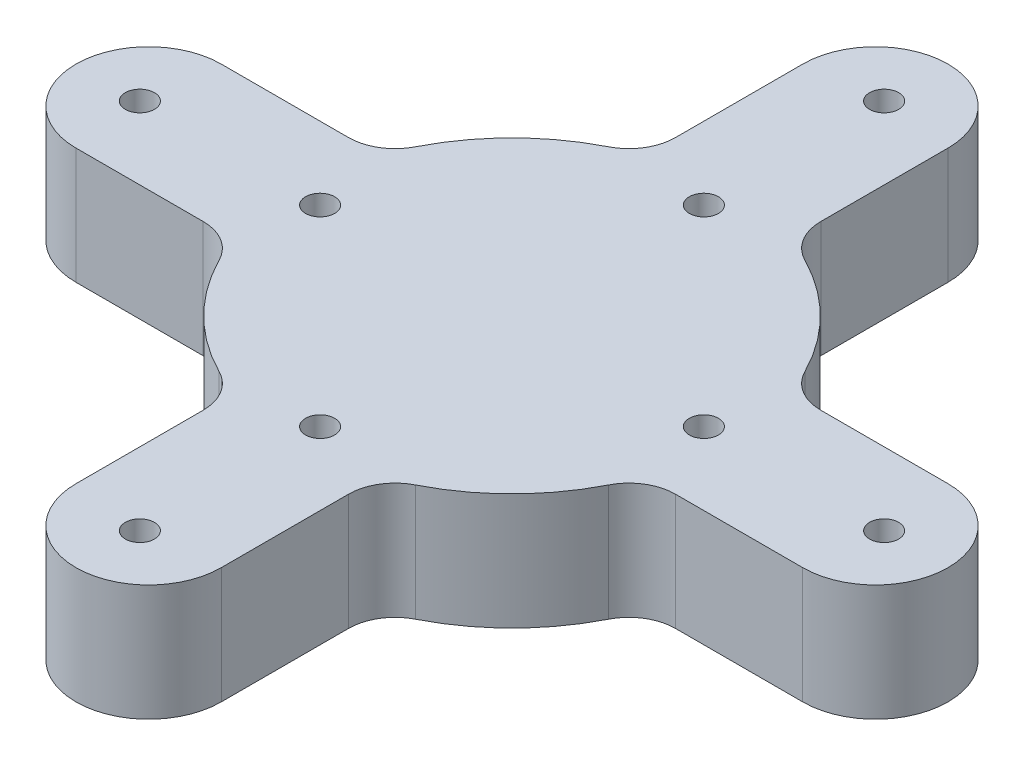
ISO-10303-21;
HEADER;
FILE_DESCRIPTION(('STEP AP214'),'2;1');
FILE_NAME('part.step','',(''),(''),'','','');
FILE_SCHEMA(('AUTOMOTIVE_DESIGN { 1 0 10303 214 1 1 1 1 }'));
ENDSEC;
DATA;
#1=APPLICATION_CONTEXT('core data for automotive mechanical design processes');
#2=APPLICATION_PROTOCOL_DEFINITION('international standard','automotive_design',2000,#1);
#3=PRODUCT_CONTEXT('',#1,'mechanical');
#4=PRODUCT('Part','Part','',(#3));
#5=PRODUCT_RELATED_PRODUCT_CATEGORY('part','',(#4));
#6=PRODUCT_DEFINITION_FORMATION('','',#4);
#7=PRODUCT_DEFINITION_CONTEXT('part definition',#1,'design');
#8=PRODUCT_DEFINITION('design','',#6,#7);
#9=PRODUCT_DEFINITION_SHAPE('','',#8);
#10=(LENGTH_UNIT() NAMED_UNIT(*) SI_UNIT(.MILLI.,.METRE.));
#11=(NAMED_UNIT(*) PLANE_ANGLE_UNIT() SI_UNIT($,.RADIAN.));
#12=(NAMED_UNIT(*) SI_UNIT($,.STERADIAN.) SOLID_ANGLE_UNIT());
#13=UNCERTAINTY_MEASURE_WITH_UNIT(LENGTH_MEASURE(1.E-05),#10,'distance_accuracy_value','');
#14=(GEOMETRIC_REPRESENTATION_CONTEXT(3) GLOBAL_UNCERTAINTY_ASSIGNED_CONTEXT((#13)) GLOBAL_UNIT_ASSIGNED_CONTEXT((#10,
#11,#12)) REPRESENTATION_CONTEXT('',''));
#15=CARTESIAN_POINT('',(0.,0.,0.));
#16=DIRECTION('',(0.,0.,1.));
#17=DIRECTION('',(1.,0.,0.));
#18=AXIS2_PLACEMENT_3D('',#15,#16,#17);
#19=CARTESIAN_POINT('',(0.,20.,-62.4999999999996));
#20=DIRECTION('',(0.,-1.,0.));
#21=DIRECTION('',(0.,0.,-1.));
#22=AXIS2_PLACEMENT_3D('',#19,#20,#21);
#23=CYLINDRICAL_SURFACE('',#22,12.5);
#24=DIRECTION('',(0.,-1.,0.));
#25=VECTOR('',#24,1.);
#26=CARTESIAN_POINT('',(-12.5,20.,-62.4999999999996));
#27=LINE('',#26,#25);
#28=CARTESIAN_POINT('',(-12.5,20.,-62.4999999999996));
#29=VERTEX_POINT('',#28);
#30=CARTESIAN_POINT('',(-12.5,0.,-62.4999999999996));
#31=VERTEX_POINT('',#30);
#32=EDGE_CURVE('E322',#29,#31,#27,.T.);
#33=ORIENTED_EDGE('',*,*,#32,.F.);
#34=CARTESIAN_POINT('',(0.,20.,-62.4999999999996));
#35=DIRECTION('',(0.,1.,0.));
#36=DIRECTION('',(0.,0.,1.));
#37=AXIS2_PLACEMENT_3D('',#34,#35,#36);
#38=CIRCLE('',#37,12.5);
#39=CARTESIAN_POINT('',(12.5,20.,-62.4999999999996));
#40=VERTEX_POINT('',#39);
#41=EDGE_CURVE('E330',#40,#29,#38,.T.);
#42=ORIENTED_EDGE('',*,*,#41,.F.);
#43=DIRECTION('',(0.,1.,0.));
#44=VECTOR('',#43,1.);
#45=CARTESIAN_POINT('',(12.5,20.,-62.4999999999996));
#46=LINE('',#45,#44);
#47=CARTESIAN_POINT('',(12.5,0.,-62.4999999999996));
#48=VERTEX_POINT('',#47);
#49=EDGE_CURVE('E326',#48,#40,#46,.T.);
#50=ORIENTED_EDGE('',*,*,#49,.F.);
#51=CARTESIAN_POINT('',(0.,0.,-62.4999999999996));
#52=DIRECTION('',(0.,1.,0.));
#53=DIRECTION('',(0.,0.,1.));
#54=AXIS2_PLACEMENT_3D('',#51,#52,#53);
#55=CIRCLE('',#54,12.5);
#56=EDGE_CURVE('E334',#31,#48,#55,.F.);
#57=ORIENTED_EDGE('',*,*,#56,.F.);
#58=EDGE_LOOP('',(#33,#42,#50,#57));
#59=FACE_BOUND('',#58,.T.);
#60=ADVANCED_FACE('F84',(#59),#23,.T.);
#61=CARTESIAN_POINT('',(-62.5,0.,0.));
#62=DIRECTION('',(0.,-1.,0.));
#63=DIRECTION('',(0.,0.,-1.));
#64=AXIS2_PLACEMENT_3D('',#61,#62,#63);
#65=CYLINDRICAL_SURFACE('',#64,12.5);
#66=DIRECTION('',(0.,-1.,0.));
#67=VECTOR('',#66,1.);
#68=CARTESIAN_POINT('',(-62.5,20.,-12.5));
#69=LINE('',#68,#67);
#70=CARTESIAN_POINT('',(-62.5,0.,-12.5));
#71=VERTEX_POINT('',#70);
#72=CARTESIAN_POINT('',(-62.5,20.,-12.5));
#73=VERTEX_POINT('',#72);
#74=EDGE_CURVE('E308',#71,#73,#69,.F.);
#75=ORIENTED_EDGE('',*,*,#74,.F.);
#76=CARTESIAN_POINT('',(-62.5,0.,0.));
#77=DIRECTION('',(0.,1.,0.));
#78=DIRECTION('',(0.,0.,1.));
#79=AXIS2_PLACEMENT_3D('',#76,#77,#78);
#80=CIRCLE('',#79,12.5);
#81=CARTESIAN_POINT('',(-62.5,0.,12.5));
#82=VERTEX_POINT('',#81);
#83=EDGE_CURVE('E316',#82,#71,#80,.F.);
#84=ORIENTED_EDGE('',*,*,#83,.F.);
#85=DIRECTION('',(0.,1.,0.));
#86=VECTOR('',#85,1.);
#87=CARTESIAN_POINT('',(-62.5,0.,12.5));
#88=LINE('',#87,#86);
#89=CARTESIAN_POINT('',(-62.5,20.,12.5));
#90=VERTEX_POINT('',#89);
#91=EDGE_CURVE('E312',#90,#82,#88,.F.);
#92=ORIENTED_EDGE('',*,*,#91,.F.);
#93=CARTESIAN_POINT('',(-62.5,20.,0.));
#94=DIRECTION('',(0.,1.,0.));
#95=DIRECTION('',(0.,0.,1.));
#96=AXIS2_PLACEMENT_3D('',#93,#94,#95);
#97=CIRCLE('',#96,12.5);
#98=EDGE_CURVE('E319',#73,#90,#97,.T.);
#99=ORIENTED_EDGE('',*,*,#98,.F.);
#100=EDGE_LOOP('',(#75,#84,#92,#99));
#101=FACE_BOUND('',#100,.T.);
#102=ADVANCED_FACE('F617',(#101),#65,.T.);
#103=CARTESIAN_POINT('',(0.,0.,62.5000000000005));
#104=DIRECTION('',(0.,-1.,0.));
#105=DIRECTION('',(0.,0.,-1.));
#106=AXIS2_PLACEMENT_3D('',#103,#104,#105);
#107=CYLINDRICAL_SURFACE('',#106,12.5);
#108=DIRECTION('',(0.,1.,0.));
#109=VECTOR('',#108,1.);
#110=CARTESIAN_POINT('',(-12.5,0.,62.5000000000005));
#111=LINE('',#110,#109);
#112=CARTESIAN_POINT('',(-12.5,0.,62.5000000000005));
#113=VERTEX_POINT('',#112);
#114=CARTESIAN_POINT('',(-12.5,20.,62.5000000000005));
#115=VERTEX_POINT('',#114);
#116=EDGE_CURVE('E272',#113,#115,#111,.T.);
#117=ORIENTED_EDGE('',*,*,#116,.F.);
#118=CARTESIAN_POINT('',(0.,0.,62.5000000000005));
#119=DIRECTION('',(0.,1.,0.));
#120=DIRECTION('',(0.,0.,1.));
#121=AXIS2_PLACEMENT_3D('',#118,#119,#120);
#122=CIRCLE('',#121,12.5);
#123=CARTESIAN_POINT('',(12.5,0.,62.5000000000005));
#124=VERTEX_POINT('',#123);
#125=EDGE_CURVE('E302',#124,#113,#122,.F.);
#126=ORIENTED_EDGE('',*,*,#125,.F.);
#127=DIRECTION('',(0.,-1.,0.));
#128=VECTOR('',#127,1.);
#129=CARTESIAN_POINT('',(12.5,20.,62.5000000000005));
#130=LINE('',#129,#128);
#131=CARTESIAN_POINT('',(12.5,20.,62.5000000000005));
#132=VERTEX_POINT('',#131);
#133=EDGE_CURVE('E298',#132,#124,#130,.T.);
#134=ORIENTED_EDGE('',*,*,#133,.F.);
#135=CARTESIAN_POINT('',(0.,20.,62.5000000000005));
#136=DIRECTION('',(0.,1.,0.));
#137=DIRECTION('',(0.,0.,1.));
#138=AXIS2_PLACEMENT_3D('',#135,#136,#137);
#139=CIRCLE('',#138,12.5);
#140=EDGE_CURVE('E305',#115,#132,#139,.T.);
#141=ORIENTED_EDGE('',*,*,#140,.F.);
#142=EDGE_LOOP('',(#117,#126,#134,#141));
#143=FACE_BOUND('',#142,.T.);
#144=ADVANCED_FACE('F624',(#143),#107,.T.);
#145=CARTESIAN_POINT('',(62.5,0.,0.));
#146=DIRECTION('',(0.,-1.,0.));
#147=DIRECTION('',(0.,0.,-1.));
#148=AXIS2_PLACEMENT_3D('',#145,#146,#147);
#149=CYLINDRICAL_SURFACE('',#148,12.5);
#150=DIRECTION('',(0.,-1.,0.));
#151=VECTOR('',#150,1.);
#152=CARTESIAN_POINT('',(62.5,20.,12.5));
#153=LINE('',#152,#151);
#154=CARTESIAN_POINT('',(62.5,0.,12.5));
#155=VERTEX_POINT('',#154);
#156=CARTESIAN_POINT('',(62.5,20.,12.5));
#157=VERTEX_POINT('',#156);
#158=EDGE_CURVE('E268',#155,#157,#153,.F.);
#159=ORIENTED_EDGE('',*,*,#158,.F.);
#160=CARTESIAN_POINT('',(62.5,0.,0.));
#161=DIRECTION('',(0.,1.,0.));
#162=DIRECTION('',(0.,0.,1.));
#163=AXIS2_PLACEMENT_3D('',#160,#161,#162);
#164=CIRCLE('',#163,12.5);
#165=CARTESIAN_POINT('',(62.5,0.,-12.5));
#166=VERTEX_POINT('',#165);
#167=EDGE_CURVE('E273',#166,#155,#164,.F.);
#168=ORIENTED_EDGE('',*,*,#167,.F.);
#169=DIRECTION('',(0.,1.,0.));
#170=VECTOR('',#169,1.);
#171=CARTESIAN_POINT('',(62.5,0.,-12.5));
#172=LINE('',#171,#170);
#173=CARTESIAN_POINT('',(62.5,20.,-12.5));
#174=VERTEX_POINT('',#173);
#175=EDGE_CURVE('E270',#174,#166,#172,.F.);
#176=ORIENTED_EDGE('',*,*,#175,.F.);
#177=CARTESIAN_POINT('',(62.5,20.,0.));
#178=DIRECTION('',(0.,1.,0.));
#179=DIRECTION('',(0.,0.,1.));
#180=AXIS2_PLACEMENT_3D('',#177,#178,#179);
#181=CIRCLE('',#180,12.5);
#182=EDGE_CURVE('E251',#157,#174,#181,.T.);
#183=ORIENTED_EDGE('',*,*,#182,.F.);
#184=EDGE_LOOP('',(#159,#168,#176,#183));
#185=FACE_BOUND('',#184,.T.);
#186=ADVANCED_FACE('F266',(#185),#149,.T.);
#187=CARTESIAN_POINT('',(12.5,20.,0.));
#188=DIRECTION('',(-1.,0.,0.));
#189=DIRECTION('',(0.,0.,1.));
#190=AXIS2_PLACEMENT_3D('',#187,#188,#189);
#191=PLANE('',#190);
#192=DIRECTION('',(0.,0.,-1.));
#193=VECTOR('',#192,1.);
#194=CARTESIAN_POINT('',(12.5,0.,0.));
#195=LINE('',#194,#193);
#196=CARTESIAN_POINT('',(12.5,0.,40.6201920231798));
#197=VERTEX_POINT('',#196);
#198=EDGE_CURVE('E356',#124,#197,#195,.T.);
#199=ORIENTED_EDGE('',*,*,#198,.T.);
#200=DIRECTION('',(0.,1.,0.));
#201=VECTOR('',#200,1.);
#202=CARTESIAN_POINT('',(12.5,20.,40.6201920231798));
#203=LINE('',#202,#201);
#204=CARTESIAN_POINT('',(12.5,20.,40.6201920231798));
#205=VERTEX_POINT('',#204);
#206=EDGE_CURVE('E338',#197,#205,#203,.T.);
#207=ORIENTED_EDGE('',*,*,#206,.T.);
#208=DIRECTION('',(0.,0.,-1.));
#209=VECTOR('',#208,1.);
#210=CARTESIAN_POINT('',(12.5,20.,0.));
#211=LINE('',#210,#209);
#212=EDGE_CURVE('E262',#132,#205,#211,.T.);
#213=ORIENTED_EDGE('',*,*,#212,.F.);
#214=ORIENTED_EDGE('',*,*,#133,.T.);
#215=EDGE_LOOP('',(#199,#207,#213,#214));
#216=FACE_BOUND('',#215,.T.);
#217=ADVANCED_FACE('F674',(#216),#191,.F.);
#218=CARTESIAN_POINT('',(0.,20.,12.5));
#219=DIRECTION('',(0.,0.,-1.));
#220=DIRECTION('',(-1.,0.,0.));
#221=AXIS2_PLACEMENT_3D('',#218,#219,#220);
#222=PLANE('',#221);
#223=DIRECTION('',(1.,0.,0.));
#224=VECTOR('',#223,1.);
#225=CARTESIAN_POINT('',(0.,20.,12.5));
#226=LINE('',#225,#224);
#227=CARTESIAN_POINT('',(40.6201920231798,20.,12.5));
#228=VERTEX_POINT('',#227);
#229=EDGE_CURVE('E246',#228,#157,#226,.T.);
#230=ORIENTED_EDGE('',*,*,#229,.F.);
#231=DIRECTION('',(0.,1.,0.));
#232=VECTOR('',#231,1.);
#233=CARTESIAN_POINT('',(40.6201920231798,20.,12.5));
#234=LINE('',#233,#232);
#235=CARTESIAN_POINT('',(40.6201920231798,0.,12.5));
#236=VERTEX_POINT('',#235);
#237=EDGE_CURVE('E384',#228,#236,#234,.F.);
#238=ORIENTED_EDGE('',*,*,#237,.T.);
#239=DIRECTION('',(1.,0.,0.));
#240=VECTOR('',#239,1.);
#241=CARTESIAN_POINT('',(0.,0.,12.5));
#242=LINE('',#241,#240);
#243=EDGE_CURVE('E277',#236,#155,#242,.T.);
#244=ORIENTED_EDGE('',*,*,#243,.T.);
#245=ORIENTED_EDGE('',*,*,#158,.T.);
#246=EDGE_LOOP('',(#230,#238,#244,#245));
#247=FACE_BOUND('',#246,.T.);
#248=ADVANCED_FACE('F275',(#247),#222,.F.);
#249=CARTESIAN_POINT('',(0.,20.,-12.5));
#250=DIRECTION('',(0.,0.,-1.));
#251=DIRECTION('',(-1.,0.,0.));
#252=AXIS2_PLACEMENT_3D('',#249,#250,#251);
#253=PLANE('',#252);
#254=DIRECTION('',(1.,0.,0.));
#255=VECTOR('',#254,1.);
#256=CARTESIAN_POINT('',(0.,0.,-12.5));
#257=LINE('',#256,#255);
#258=CARTESIAN_POINT('',(40.6201920231798,0.,-12.5));
#259=VERTEX_POINT('',#258);
#260=EDGE_CURVE('E501',#259,#166,#257,.T.);
#261=ORIENTED_EDGE('',*,*,#260,.F.);
#262=DIRECTION('',(0.,-1.,0.));
#263=VECTOR('',#262,1.);
#264=CARTESIAN_POINT('',(40.6201920231798,20.,-12.5));
#265=LINE('',#264,#263);
#266=CARTESIAN_POINT('',(40.6201920231798,20.,-12.5));
#267=VERTEX_POINT('',#266);
#268=EDGE_CURVE('E394',#259,#267,#265,.F.);
#269=ORIENTED_EDGE('',*,*,#268,.T.);
#270=DIRECTION('',(1.,0.,0.));
#271=VECTOR('',#270,1.);
#272=CARTESIAN_POINT('',(0.,20.,-12.5));
#273=LINE('',#272,#271);
#274=EDGE_CURVE('E261',#267,#174,#273,.T.);
#275=ORIENTED_EDGE('',*,*,#274,.T.);
#276=ORIENTED_EDGE('',*,*,#175,.T.);
#277=EDGE_LOOP('',(#261,#269,#275,#276));
#278=FACE_BOUND('',#277,.T.);
#279=ADVANCED_FACE('F741',(#278),#253,.T.);
#280=CARTESIAN_POINT('',(12.5,20.,0.));
#281=DIRECTION('',(-1.,0.,0.));
#282=DIRECTION('',(0.,0.,1.));
#283=AXIS2_PLACEMENT_3D('',#280,#281,#282);
#284=PLANE('',#283);
#285=DIRECTION('',(0.,0.,-1.));
#286=VECTOR('',#285,1.);
#287=CARTESIAN_POINT('',(12.5,20.,0.));
#288=LINE('',#287,#286);
#289=CARTESIAN_POINT('',(12.5,20.,-40.6201920231798));
#290=VERTEX_POINT('',#289);
#291=EDGE_CURVE('E518',#290,#40,#288,.T.);
#292=ORIENTED_EDGE('',*,*,#291,.F.);
#293=DIRECTION('',(0.,1.,0.));
#294=VECTOR('',#293,1.);
#295=CARTESIAN_POINT('',(12.5,20.,-40.6201920231798));
#296=LINE('',#295,#294);
#297=CARTESIAN_POINT('',(12.5,0.,-40.6201920231798));
#298=VERTEX_POINT('',#297);
#299=EDGE_CURVE('E397',#290,#298,#296,.F.);
#300=ORIENTED_EDGE('',*,*,#299,.T.);
#301=DIRECTION('',(0.,0.,-1.));
#302=VECTOR('',#301,1.);
#303=CARTESIAN_POINT('',(12.5,0.,0.));
#304=LINE('',#303,#302);
#305=EDGE_CURVE('E498',#298,#48,#304,.T.);
#306=ORIENTED_EDGE('',*,*,#305,.T.);
#307=ORIENTED_EDGE('',*,*,#49,.T.);
#308=EDGE_LOOP('',(#292,#300,#306,#307));
#309=FACE_BOUND('',#308,.T.);
#310=ADVANCED_FACE('F716',(#309),#284,.F.);
#311=CARTESIAN_POINT('',(-12.5,20.,0.));
#312=DIRECTION('',(-1.,0.,0.));
#313=DIRECTION('',(0.,0.,1.));
#314=AXIS2_PLACEMENT_3D('',#311,#312,#313);
#315=PLANE('',#314);
#316=DIRECTION('',(0.,0.,-1.));
#317=VECTOR('',#316,1.);
#318=CARTESIAN_POINT('',(-12.5,0.,0.));
#319=LINE('',#318,#317);
#320=CARTESIAN_POINT('',(-12.5,0.,-40.6201920231798));
#321=VERTEX_POINT('',#320);
#322=EDGE_CURVE('E493',#321,#31,#319,.T.);
#323=ORIENTED_EDGE('',*,*,#322,.F.);
#324=DIRECTION('',(0.,-1.,0.));
#325=VECTOR('',#324,1.);
#326=CARTESIAN_POINT('',(-12.5,20.,-40.6201920231798));
#327=LINE('',#326,#325);
#328=CARTESIAN_POINT('',(-12.5,20.,-40.6201920231798));
#329=VERTEX_POINT('',#328);
#330=EDGE_CURVE('E409',#321,#329,#327,.F.);
#331=ORIENTED_EDGE('',*,*,#330,.T.);
#332=DIRECTION('',(0.,0.,-1.));
#333=VECTOR('',#332,1.);
#334=CARTESIAN_POINT('',(-12.5,20.,0.));
#335=LINE('',#334,#333);
#336=EDGE_CURVE('E515',#329,#29,#335,.T.);
#337=ORIENTED_EDGE('',*,*,#336,.T.);
#338=ORIENTED_EDGE('',*,*,#32,.T.);
#339=EDGE_LOOP('',(#323,#331,#337,#338));
#340=FACE_BOUND('',#339,.T.);
#341=ADVANCED_FACE('F710',(#340),#315,.T.);
#342=CARTESIAN_POINT('',(0.,20.,-12.5));
#343=DIRECTION('',(0.,0.,-1.));
#344=DIRECTION('',(-1.,0.,0.));
#345=AXIS2_PLACEMENT_3D('',#342,#343,#344);
#346=PLANE('',#345);
#347=DIRECTION('',(1.,0.,0.));
#348=VECTOR('',#347,1.);
#349=CARTESIAN_POINT('',(0.,20.,-12.5));
#350=LINE('',#349,#348);
#351=CARTESIAN_POINT('',(-40.6201920231798,20.,-12.5));
#352=VERTEX_POINT('',#351);
#353=EDGE_CURVE('E511',#73,#352,#350,.T.);
#354=ORIENTED_EDGE('',*,*,#353,.T.);
#355=DIRECTION('',(0.,-1.,0.));
#356=VECTOR('',#355,1.);
#357=CARTESIAN_POINT('',(-40.6201920231798,0.,-12.5));
#358=LINE('',#357,#356);
#359=CARTESIAN_POINT('',(-40.6201920231798,0.,-12.5));
#360=VERTEX_POINT('',#359);
#361=EDGE_CURVE('E412',#352,#360,#358,.T.);
#362=ORIENTED_EDGE('',*,*,#361,.T.);
#363=DIRECTION('',(1.,0.,0.));
#364=VECTOR('',#363,1.);
#365=CARTESIAN_POINT('',(0.,0.,-12.5));
#366=LINE('',#365,#364);
#367=EDGE_CURVE('E487',#71,#360,#366,.T.);
#368=ORIENTED_EDGE('',*,*,#367,.F.);
#369=ORIENTED_EDGE('',*,*,#74,.T.);
#370=EDGE_LOOP('',(#354,#362,#368,#369));
#371=FACE_BOUND('',#370,.T.);
#372=ADVANCED_FACE('F727',(#371),#346,.T.);
#373=CARTESIAN_POINT('',(0.,20.,12.5));
#374=DIRECTION('',(0.,0.,-1.));
#375=DIRECTION('',(-1.,0.,0.));
#376=AXIS2_PLACEMENT_3D('',#373,#374,#375);
#377=PLANE('',#376);
#378=DIRECTION('',(1.,0.,0.));
#379=VECTOR('',#378,1.);
#380=CARTESIAN_POINT('',(0.,0.,12.5));
#381=LINE('',#380,#379);
#382=CARTESIAN_POINT('',(-40.6201920231798,0.,12.5));
#383=VERTEX_POINT('',#382);
#384=EDGE_CURVE('E484',#82,#383,#381,.T.);
#385=ORIENTED_EDGE('',*,*,#384,.T.);
#386=DIRECTION('',(0.,1.,0.));
#387=VECTOR('',#386,1.);
#388=CARTESIAN_POINT('',(-40.6201920231798,20.,12.5));
#389=LINE('',#388,#387);
#390=CARTESIAN_POINT('',(-40.6201920231798,20.,12.5));
#391=VERTEX_POINT('',#390);
#392=EDGE_CURVE('E425',#383,#391,#389,.T.);
#393=ORIENTED_EDGE('',*,*,#392,.T.);
#394=DIRECTION('',(1.,0.,0.));
#395=VECTOR('',#394,1.);
#396=CARTESIAN_POINT('',(0.,20.,12.5));
#397=LINE('',#396,#395);
#398=EDGE_CURVE('E287',#90,#391,#397,.T.);
#399=ORIENTED_EDGE('',*,*,#398,.F.);
#400=ORIENTED_EDGE('',*,*,#91,.T.);
#401=EDGE_LOOP('',(#385,#393,#399,#400));
#402=FACE_BOUND('',#401,.T.);
#403=ADVANCED_FACE('F483',(#402),#377,.F.);
#404=CARTESIAN_POINT('',(-12.5,20.,0.));
#405=DIRECTION('',(-1.,0.,0.));
#406=DIRECTION('',(0.,0.,1.));
#407=AXIS2_PLACEMENT_3D('',#404,#405,#406);
#408=PLANE('',#407);
#409=DIRECTION('',(0.,0.,-1.));
#410=VECTOR('',#409,1.);
#411=CARTESIAN_POINT('',(-12.5,20.,0.));
#412=LINE('',#411,#410);
#413=CARTESIAN_POINT('',(-12.5,20.,40.6201920231798));
#414=VERTEX_POINT('',#413);
#415=EDGE_CURVE('E280',#115,#414,#412,.T.);
#416=ORIENTED_EDGE('',*,*,#415,.T.);
#417=DIRECTION('',(0.,-1.,0.));
#418=VECTOR('',#417,1.);
#419=CARTESIAN_POINT('',(-12.5,0.,40.6201920231798));
#420=LINE('',#419,#418);
#421=CARTESIAN_POINT('',(-12.5,0.,40.6201920231798));
#422=VERTEX_POINT('',#421);
#423=EDGE_CURVE('E422',#414,#422,#420,.T.);
#424=ORIENTED_EDGE('',*,*,#423,.T.);
#425=DIRECTION('',(0.,0.,-1.));
#426=VECTOR('',#425,1.);
#427=CARTESIAN_POINT('',(-12.5,0.,0.));
#428=LINE('',#427,#426);
#429=EDGE_CURVE('E290',#113,#422,#428,.T.);
#430=ORIENTED_EDGE('',*,*,#429,.F.);
#431=ORIENTED_EDGE('',*,*,#116,.T.);
#432=EDGE_LOOP('',(#416,#424,#430,#431));
#433=FACE_BOUND('',#432,.T.);
#434=ADVANCED_FACE('F569',(#433),#408,.T.);
#435=CARTESIAN_POINT('',(0.,20.,0.));
#436=DIRECTION('',(0.,1.,0.));
#437=DIRECTION('',(0.,0.,1.));
#438=AXIS2_PLACEMENT_3D('',#435,#436,#437);
#439=PLANE('',#438);
#440=CARTESIAN_POINT('',(0.,20.,-33.));
#441=DIRECTION('',(0.,1.,0.));
#442=DIRECTION('',(0.,0.,1.));
#443=AXIS2_PLACEMENT_3D('',#440,#441,#442);
#444=CIRCLE('',#443,2.5);
#445=CARTESIAN_POINT('',(0.,20.,-30.5));
#446=VERTEX_POINT('',#445);
#447=EDGE_CURVE('E362',#446,#446,#444,.T.);
#448=ORIENTED_EDGE('',*,*,#447,.F.);
#449=EDGE_LOOP('',(#448));
#450=FACE_BOUND('',#449,.T.);
#451=CARTESIAN_POINT('',(33.,20.,1.15218884181823E-13));
#452=DIRECTION('',(0.,1.,0.));
#453=DIRECTION('',(0.,0.,1.));
#454=AXIS2_PLACEMENT_3D('',#451,#452,#453);
#455=CIRCLE('',#454,2.5);
#456=CARTESIAN_POINT('',(33.,20.,2.50000000000012));
#457=VERTEX_POINT('',#456);
#458=EDGE_CURVE('E554',#457,#457,#455,.T.);
#459=ORIENTED_EDGE('',*,*,#458,.F.);
#460=EDGE_LOOP('',(#459));
#461=FACE_BOUND('',#460,.T.);
#462=CARTESIAN_POINT('',(-2.30437768363647E-13,20.,33.));
#463=DIRECTION('',(0.,1.,0.));
#464=DIRECTION('',(0.,0.,1.));
#465=AXIS2_PLACEMENT_3D('',#462,#463,#464);
#466=CIRCLE('',#465,2.5);
#467=CARTESIAN_POINT('',(-2.30437768363647E-13,20.,35.5));
#468=VERTEX_POINT('',#467);
#469=EDGE_CURVE('E550',#468,#468,#466,.T.);
#470=ORIENTED_EDGE('',*,*,#469,.F.);
#471=EDGE_LOOP('',(#470));
#472=FACE_BOUND('',#471,.T.);
#473=CARTESIAN_POINT('',(-33.,20.,-3.4565665254547E-13));
#474=DIRECTION('',(0.,1.,0.));
#475=DIRECTION('',(0.,0.,1.));
#476=AXIS2_PLACEMENT_3D('',#473,#474,#475);
#477=CIRCLE('',#476,2.5);
#478=CARTESIAN_POINT('',(-33.,20.,2.49999999999966));
#479=VERTEX_POINT('',#478);
#480=EDGE_CURVE('E546',#479,#479,#477,.T.);
#481=ORIENTED_EDGE('',*,*,#480,.F.);
#482=EDGE_LOOP('',(#481));
#483=FACE_BOUND('',#482,.T.);
#484=ORIENTED_EDGE('',*,*,#274,.F.);
#485=CARTESIAN_POINT('',(40.6201920231798,20.,-20.5));
#486=DIRECTION('',(0.,1.,0.));
#487=DIRECTION('',(0.,0.,1.));
#488=AXIS2_PLACEMENT_3D('',#485,#486,#487);
#489=CIRCLE('',#488,8.);
#490=CARTESIAN_POINT('',(33.4781802388844,20.,-16.8956043956044));
#491=VERTEX_POINT('',#490);
#492=EDGE_CURVE('E442',#267,#491,#489,.F.);
#493=ORIENTED_EDGE('',*,*,#492,.T.);
#494=CARTESIAN_POINT('',(0.,20.,0.));
#495=DIRECTION('',(0.,1.,0.));
#496=DIRECTION('',(0.,0.,1.));
#497=AXIS2_PLACEMENT_3D('',#494,#495,#496);
#498=CIRCLE('',#497,37.5);
#499=CARTESIAN_POINT('',(16.8956043956044,20.,-33.4781802388845));
#500=VERTEX_POINT('',#499);
#501=EDGE_CURVE('E684',#491,#500,#498,.T.);
#502=ORIENTED_EDGE('',*,*,#501,.T.);
#503=CARTESIAN_POINT('',(20.5,20.,-40.6201920231798));
#504=DIRECTION('',(0.,1.,0.));
#505=DIRECTION('',(0.,0.,1.));
#506=AXIS2_PLACEMENT_3D('',#503,#504,#505);
#507=CIRCLE('',#506,8.);
#508=EDGE_CURVE('E448',#500,#290,#507,.F.);
#509=ORIENTED_EDGE('',*,*,#508,.T.);
#510=ORIENTED_EDGE('',*,*,#291,.T.);
#511=ORIENTED_EDGE('',*,*,#41,.T.);
#512=ORIENTED_EDGE('',*,*,#336,.F.);
#513=CARTESIAN_POINT('',(-20.5,20.,-40.6201920231798));
#514=DIRECTION('',(0.,1.,0.));
#515=DIRECTION('',(0.,0.,1.));
#516=AXIS2_PLACEMENT_3D('',#513,#514,#515);
#517=CIRCLE('',#516,8.);
#518=CARTESIAN_POINT('',(-16.8956043956044,20.,-33.4781802388845));
#519=VERTEX_POINT('',#518);
#520=EDGE_CURVE('E454',#329,#519,#517,.F.);
#521=ORIENTED_EDGE('',*,*,#520,.T.);
#522=CARTESIAN_POINT('',(-33.4781802388844,20.,-16.8956043956044));
#523=VERTEX_POINT('',#522);
#524=EDGE_CURVE('E479',#519,#523,#498,.T.);
#525=ORIENTED_EDGE('',*,*,#524,.T.);
#526=CARTESIAN_POINT('',(-40.6201920231798,20.,-20.5));
#527=DIRECTION('',(0.,1.,0.));
#528=DIRECTION('',(0.,0.,1.));
#529=AXIS2_PLACEMENT_3D('',#526,#527,#528);
#530=CIRCLE('',#529,8.);
#531=EDGE_CURVE('E457',#523,#352,#530,.F.);
#532=ORIENTED_EDGE('',*,*,#531,.T.);
#533=ORIENTED_EDGE('',*,*,#353,.F.);
#534=ORIENTED_EDGE('',*,*,#98,.T.);
#535=ORIENTED_EDGE('',*,*,#398,.T.);
#536=CARTESIAN_POINT('',(-40.6201920231798,20.,20.5));
#537=DIRECTION('',(0.,1.,0.));
#538=DIRECTION('',(0.,0.,1.));
#539=AXIS2_PLACEMENT_3D('',#536,#537,#538);
#540=CIRCLE('',#539,8.);
#541=CARTESIAN_POINT('',(-33.4781802388845,20.,16.8956043956044));
#542=VERTEX_POINT('',#541);
#543=EDGE_CURVE('E93',#391,#542,#540,.F.);
#544=ORIENTED_EDGE('',*,*,#543,.T.);
#545=CARTESIAN_POINT('',(-16.8956043956044,20.,33.4781802388845));
#546=VERTEX_POINT('',#545);
#547=EDGE_CURVE('E374',#542,#546,#498,.T.);
#548=ORIENTED_EDGE('',*,*,#547,.T.);
#549=CARTESIAN_POINT('',(-20.5,20.,40.6201920231798));
#550=DIRECTION('',(0.,1.,0.));
#551=DIRECTION('',(0.,0.,1.));
#552=AXIS2_PLACEMENT_3D('',#549,#550,#551);
#553=CIRCLE('',#552,8.);
#554=EDGE_CURVE('E463',#546,#414,#553,.F.);
#555=ORIENTED_EDGE('',*,*,#554,.T.);
#556=ORIENTED_EDGE('',*,*,#415,.F.);
#557=ORIENTED_EDGE('',*,*,#140,.T.);
#558=ORIENTED_EDGE('',*,*,#212,.T.);
#559=CARTESIAN_POINT('',(20.5,20.,40.6201920231798));
#560=DIRECTION('',(0.,1.,0.));
#561=DIRECTION('',(0.,0.,1.));
#562=AXIS2_PLACEMENT_3D('',#559,#560,#561);
#563=CIRCLE('',#562,8.);
#564=CARTESIAN_POINT('',(16.8956043956044,20.,33.4781802388845));
#565=VERTEX_POINT('',#564);
#566=EDGE_CURVE('E428',#205,#565,#563,.F.);
#567=ORIENTED_EDGE('',*,*,#566,.T.);
#568=CARTESIAN_POINT('',(33.4781802388845,20.,16.8956043956044));
#569=VERTEX_POINT('',#568);
#570=EDGE_CURVE('E481',#565,#569,#498,.T.);
#571=ORIENTED_EDGE('',*,*,#570,.T.);
#572=CARTESIAN_POINT('',(40.6201920231798,20.,20.5));
#573=DIRECTION('',(0.,1.,0.));
#574=DIRECTION('',(0.,0.,1.));
#575=AXIS2_PLACEMENT_3D('',#572,#573,#574);
#576=CIRCLE('',#575,8.);
#577=EDGE_CURVE('E255',#569,#228,#576,.F.);
#578=ORIENTED_EDGE('',*,*,#577,.T.);
#579=ORIENTED_EDGE('',*,*,#229,.T.);
#580=ORIENTED_EDGE('',*,*,#182,.T.);
#581=EDGE_LOOP('',(#484,#493,#502,#509,#510,#511,#512,#521,#525,#532,#533,#534,#535,#544,#548,
#555,#556,#557,#558,#567,#571,#578,#579,#580));
#582=FACE_BOUND('',#581,.T.);
#583=CARTESIAN_POINT('',(-2.25189529161937E-13,20.,64.));
#584=DIRECTION('',(0.,1.,0.));
#585=DIRECTION('',(0.,0.,1.));
#586=AXIS2_PLACEMENT_3D('',#583,#584,#585);
#587=CIRCLE('',#586,2.49999999999999);
#588=CARTESIAN_POINT('',(-2.25189529161937E-13,20.,66.5));
#589=VERTEX_POINT('',#588);
#590=EDGE_CURVE('E535',#589,#589,#587,.T.);
#591=ORIENTED_EDGE('',*,*,#590,.F.);
#592=EDGE_LOOP('',(#591));
#593=FACE_BOUND('',#592,.T.);
#594=CARTESIAN_POINT('',(-64.,20.,-4.48644334847898E-13));
#595=DIRECTION('',(0.,1.,0.));
#596=DIRECTION('',(0.,0.,1.));
#597=AXIS2_PLACEMENT_3D('',#594,#595,#596);
#598=CIRCLE('',#597,2.49999999999999);
#599=CARTESIAN_POINT('',(-64.,20.,2.49999999999954));
#600=VERTEX_POINT('',#599);
#601=EDGE_CURVE('E530',#600,#600,#598,.T.);
#602=ORIENTED_EDGE('',*,*,#601,.F.);
#603=EDGE_LOOP('',(#602));
#604=FACE_BOUND('',#603,.T.);
#605=CARTESIAN_POINT('',(6.72099140533858E-13,20.,-64.));
#606=DIRECTION('',(0.,1.,0.));
#607=DIRECTION('',(0.,0.,1.));
#608=AXIS2_PLACEMENT_3D('',#605,#606,#607);
#609=CIRCLE('',#608,2.5);
#610=CARTESIAN_POINT('',(6.72099140533858E-13,20.,-61.5));
#611=VERTEX_POINT('',#610);
#612=EDGE_CURVE('E526',#611,#611,#609,.T.);
#613=ORIENTED_EDGE('',*,*,#612,.F.);
#614=EDGE_LOOP('',(#613));
#615=FACE_BOUND('',#614,.T.);
#616=CARTESIAN_POINT('',(64.,20.,0.));
#617=DIRECTION('',(0.,1.,0.));
#618=DIRECTION('',(0.,0.,1.));
#619=AXIS2_PLACEMENT_3D('',#616,#617,#618);
#620=CIRCLE('',#619,2.5);
#621=CARTESIAN_POINT('',(64.,20.,2.5));
#622=VERTEX_POINT('',#621);
#623=EDGE_CURVE('E344',#622,#622,#620,.T.);
#624=ORIENTED_EDGE('',*,*,#623,.F.);
#625=EDGE_LOOP('',(#624));
#626=FACE_BOUND('',#625,.T.);
#627=ADVANCED_FACE('F249',(#450,#461,#472,#483,#582,#593,#604,#615,#626),#439,.T.);
#628=CARTESIAN_POINT('',(0.,0.,0.));
#629=DIRECTION('',(0.,1.,0.));
#630=DIRECTION('',(0.,0.,1.));
#631=AXIS2_PLACEMENT_3D('',#628,#629,#630);
#632=PLANE('',#631);
#633=CARTESIAN_POINT('',(0.,0.,-33.));
#634=DIRECTION('',(0.,1.,0.));
#635=DIRECTION('',(0.,0.,1.));
#636=AXIS2_PLACEMENT_3D('',#633,#634,#635);
#637=CIRCLE('',#636,2.5);
#638=CARTESIAN_POINT('',(0.,0.,-30.5));
#639=VERTEX_POINT('',#638);
#640=EDGE_CURVE('E370',#639,#639,#637,.T.);
#641=ORIENTED_EDGE('',*,*,#640,.T.);
#642=EDGE_LOOP('',(#641));
#643=FACE_BOUND('',#642,.T.);
#644=CARTESIAN_POINT('',(33.,0.,1.15218884181823E-13));
#645=DIRECTION('',(0.,1.,0.));
#646=DIRECTION('',(0.,0.,1.));
#647=AXIS2_PLACEMENT_3D('',#644,#645,#646);
#648=CIRCLE('',#647,2.5);
#649=CARTESIAN_POINT('',(33.,0.,2.50000000000012));
#650=VERTEX_POINT('',#649);
#651=EDGE_CURVE('E366',#650,#650,#648,.T.);
#652=ORIENTED_EDGE('',*,*,#651,.T.);
#653=EDGE_LOOP('',(#652));
#654=FACE_BOUND('',#653,.T.);
#655=CARTESIAN_POINT('',(-2.30437768363647E-13,0.,33.));
#656=DIRECTION('',(0.,1.,0.));
#657=DIRECTION('',(0.,0.,1.));
#658=AXIS2_PLACEMENT_3D('',#655,#656,#657);
#659=CIRCLE('',#658,2.5);
#660=CARTESIAN_POINT('',(-2.30437768363647E-13,0.,35.5));
#661=VERTEX_POINT('',#660);
#662=EDGE_CURVE('E361',#661,#661,#659,.T.);
#663=ORIENTED_EDGE('',*,*,#662,.T.);
#664=EDGE_LOOP('',(#663));
#665=FACE_BOUND('',#664,.T.);
#666=CARTESIAN_POINT('',(-33.,0.,-3.4565665254547E-13));
#667=DIRECTION('',(0.,1.,0.));
#668=DIRECTION('',(0.,0.,1.));
#669=AXIS2_PLACEMENT_3D('',#666,#667,#668);
#670=CIRCLE('',#669,2.5);
#671=CARTESIAN_POINT('',(-33.,0.,2.49999999999966));
#672=VERTEX_POINT('',#671);
#673=EDGE_CURVE('E357',#672,#672,#670,.T.);
#674=ORIENTED_EDGE('',*,*,#673,.T.);
#675=EDGE_LOOP('',(#674));
#676=FACE_BOUND('',#675,.T.);
#677=CARTESIAN_POINT('',(0.,0.,0.));
#678=DIRECTION('',(0.,1.,0.));
#679=DIRECTION('',(0.,0.,1.));
#680=AXIS2_PLACEMENT_3D('',#677,#678,#679);
#681=CIRCLE('',#680,37.5);
#682=CARTESIAN_POINT('',(33.4781802388844,0.,-16.8956043956044));
#683=VERTEX_POINT('',#682);
#684=CARTESIAN_POINT('',(16.8956043956044,0.,-33.4781802388845));
#685=VERTEX_POINT('',#684);
#686=EDGE_CURVE('E592',#683,#685,#681,.T.);
#687=ORIENTED_EDGE('',*,*,#686,.F.);
#688=CARTESIAN_POINT('',(40.6201920231798,0.,-20.5));
#689=DIRECTION('',(0.,1.,0.));
#690=DIRECTION('',(0.,0.,1.));
#691=AXIS2_PLACEMENT_3D('',#688,#689,#690);
#692=CIRCLE('',#691,8.);
#693=EDGE_CURVE('E439',#683,#259,#692,.T.);
#694=ORIENTED_EDGE('',*,*,#693,.T.);
#695=ORIENTED_EDGE('',*,*,#260,.T.);
#696=ORIENTED_EDGE('',*,*,#167,.T.);
#697=ORIENTED_EDGE('',*,*,#243,.F.);
#698=CARTESIAN_POINT('',(40.6201920231798,0.,20.5));
#699=DIRECTION('',(0.,1.,0.));
#700=DIRECTION('',(0.,0.,1.));
#701=AXIS2_PLACEMENT_3D('',#698,#699,#700);
#702=CIRCLE('',#701,8.);
#703=CARTESIAN_POINT('',(33.4781802388845,0.,16.8956043956044));
#704=VERTEX_POINT('',#703);
#705=EDGE_CURVE('E434',#236,#704,#702,.T.);
#706=ORIENTED_EDGE('',*,*,#705,.T.);
#707=CARTESIAN_POINT('',(16.8956043956044,0.,33.4781802388845));
#708=VERTEX_POINT('',#707);
#709=EDGE_CURVE('E531',#708,#704,#681,.T.);
#710=ORIENTED_EDGE('',*,*,#709,.F.);
#711=CARTESIAN_POINT('',(20.5,0.,40.6201920231798));
#712=DIRECTION('',(0.,1.,0.));
#713=DIRECTION('',(0.,0.,1.));
#714=AXIS2_PLACEMENT_3D('',#711,#712,#713);
#715=CIRCLE('',#714,8.);
#716=EDGE_CURVE('E431',#708,#197,#715,.T.);
#717=ORIENTED_EDGE('',*,*,#716,.T.);
#718=ORIENTED_EDGE('',*,*,#198,.F.);
#719=ORIENTED_EDGE('',*,*,#125,.T.);
#720=ORIENTED_EDGE('',*,*,#429,.T.);
#721=CARTESIAN_POINT('',(-20.5,0.,40.6201920231798));
#722=DIRECTION('',(0.,1.,0.));
#723=DIRECTION('',(0.,0.,1.));
#724=AXIS2_PLACEMENT_3D('',#721,#722,#723);
#725=CIRCLE('',#724,8.);
#726=CARTESIAN_POINT('',(-16.8956043956044,0.,33.4781802388845));
#727=VERTEX_POINT('',#726);
#728=EDGE_CURVE('E466',#422,#727,#725,.T.);
#729=ORIENTED_EDGE('',*,*,#728,.T.);
#730=CARTESIAN_POINT('',(-33.4781802388845,0.,16.8956043956044));
#731=VERTEX_POINT('',#730);
#732=EDGE_CURVE('E542',#731,#727,#681,.T.);
#733=ORIENTED_EDGE('',*,*,#732,.F.);
#734=CARTESIAN_POINT('',(-40.6201920231798,0.,20.5));
#735=DIRECTION('',(0.,1.,0.));
#736=DIRECTION('',(0.,0.,1.));
#737=AXIS2_PLACEMENT_3D('',#734,#735,#736);
#738=CIRCLE('',#737,8.);
#739=EDGE_CURVE('E12',#731,#383,#738,.T.);
#740=ORIENTED_EDGE('',*,*,#739,.T.);
#741=ORIENTED_EDGE('',*,*,#384,.F.);
#742=ORIENTED_EDGE('',*,*,#83,.T.);
#743=ORIENTED_EDGE('',*,*,#367,.T.);
#744=CARTESIAN_POINT('',(-40.6201920231798,0.,-20.5));
#745=DIRECTION('',(0.,1.,0.));
#746=DIRECTION('',(0.,0.,1.));
#747=AXIS2_PLACEMENT_3D('',#744,#745,#746);
#748=CIRCLE('',#747,8.);
#749=CARTESIAN_POINT('',(-33.4781802388844,0.,-16.8956043956044));
#750=VERTEX_POINT('',#749);
#751=EDGE_CURVE('E460',#360,#750,#748,.T.);
#752=ORIENTED_EDGE('',*,*,#751,.T.);
#753=CARTESIAN_POINT('',(-16.8956043956044,0.,-33.4781802388845));
#754=VERTEX_POINT('',#753);
#755=EDGE_CURVE('E545',#754,#750,#681,.T.);
#756=ORIENTED_EDGE('',*,*,#755,.F.);
#757=CARTESIAN_POINT('',(-20.5,0.,-40.6201920231798));
#758=DIRECTION('',(0.,1.,0.));
#759=DIRECTION('',(0.,0.,1.));
#760=AXIS2_PLACEMENT_3D('',#757,#758,#759);
#761=CIRCLE('',#760,8.);
#762=EDGE_CURVE('E451',#754,#321,#761,.T.);
#763=ORIENTED_EDGE('',*,*,#762,.T.);
#764=ORIENTED_EDGE('',*,*,#322,.T.);
#765=ORIENTED_EDGE('',*,*,#56,.T.);
#766=ORIENTED_EDGE('',*,*,#305,.F.);
#767=CARTESIAN_POINT('',(20.5,0.,-40.6201920231798));
#768=DIRECTION('',(0.,1.,0.));
#769=DIRECTION('',(0.,0.,1.));
#770=AXIS2_PLACEMENT_3D('',#767,#768,#769);
#771=CIRCLE('',#770,8.);
#772=EDGE_CURVE('E445',#298,#685,#771,.T.);
#773=ORIENTED_EDGE('',*,*,#772,.T.);
#774=EDGE_LOOP('',(#687,#694,#695,#696,#697,#706,#710,#717,#718,#719,#720,#729,#733,#740,#741,
#742,#743,#752,#756,#763,#764,#765,#766,#773));
#775=FACE_BOUND('',#774,.T.);
#776=CARTESIAN_POINT('',(-2.25189529161937E-13,0.,64.));
#777=DIRECTION('',(0.,1.,0.));
#778=DIRECTION('',(0.,0.,1.));
#779=AXIS2_PLACEMENT_3D('',#776,#777,#778);
#780=CIRCLE('',#779,2.49999999999999);
#781=CARTESIAN_POINT('',(-2.25189529161937E-13,0.,66.5));
#782=VERTEX_POINT('',#781);
#783=EDGE_CURVE('E348',#782,#782,#780,.T.);
#784=ORIENTED_EDGE('',*,*,#783,.T.);
#785=EDGE_LOOP('',(#784));
#786=FACE_BOUND('',#785,.T.);
#787=CARTESIAN_POINT('',(-64.,0.,-4.48644334847898E-13));
#788=DIRECTION('',(0.,1.,0.));
#789=DIRECTION('',(0.,0.,1.));
#790=AXIS2_PLACEMENT_3D('',#787,#788,#789);
#791=CIRCLE('',#790,2.49999999999999);
#792=CARTESIAN_POINT('',(-64.,0.,2.49999999999954));
#793=VERTEX_POINT('',#792);
#794=EDGE_CURVE('E343',#793,#793,#791,.T.);
#795=ORIENTED_EDGE('',*,*,#794,.T.);
#796=EDGE_LOOP('',(#795));
#797=FACE_BOUND('',#796,.T.);
#798=CARTESIAN_POINT('',(6.72099140533858E-13,0.,-64.));
#799=DIRECTION('',(0.,1.,0.));
#800=DIRECTION('',(0.,0.,1.));
#801=AXIS2_PLACEMENT_3D('',#798,#799,#800);
#802=CIRCLE('',#801,2.5);
#803=CARTESIAN_POINT('',(6.72099140533858E-13,0.,-61.5));
#804=VERTEX_POINT('',#803);
#805=EDGE_CURVE('E339',#804,#804,#802,.T.);
#806=ORIENTED_EDGE('',*,*,#805,.T.);
#807=EDGE_LOOP('',(#806));
#808=FACE_BOUND('',#807,.T.);
#809=CARTESIAN_POINT('',(64.,0.,0.));
#810=DIRECTION('',(0.,1.,0.));
#811=DIRECTION('',(0.,0.,1.));
#812=AXIS2_PLACEMENT_3D('',#809,#810,#811);
#813=CIRCLE('',#812,2.5);
#814=CARTESIAN_POINT('',(64.,0.,2.5));
#815=VERTEX_POINT('',#814);
#816=EDGE_CURVE('E352',#815,#815,#813,.T.);
#817=ORIENTED_EDGE('',*,*,#816,.T.);
#818=EDGE_LOOP('',(#817));
#819=FACE_BOUND('',#818,.T.);
#820=ADVANCED_FACE('F568',(#643,#654,#665,#676,#775,#786,#797,#808,#819),#632,.F.);
#821=CARTESIAN_POINT('',(6.72099140533858E-13,-5.,-64.));
#822=DIRECTION('',(0.,1.,0.));
#823=DIRECTION('',(0.,0.,1.));
#824=AXIS2_PLACEMENT_3D('',#821,#822,#823);
#825=CYLINDRICAL_SURFACE('',#824,2.5);
#826=ORIENTED_EDGE('',*,*,#612,.T.);
#827=EDGE_LOOP('',(#826));
#828=FACE_BOUND('',#827,.T.);
#829=ORIENTED_EDGE('',*,*,#805,.F.);
#830=EDGE_LOOP('',(#829));
#831=FACE_BOUND('',#830,.T.);
#832=ADVANCED_FACE('F586',(#828,#831),#825,.F.);
#833=CARTESIAN_POINT('',(-64.,-5.,-4.48644334847898E-13));
#834=DIRECTION('',(0.,1.,0.));
#835=DIRECTION('',(0.,0.,1.));
#836=AXIS2_PLACEMENT_3D('',#833,#834,#835);
#837=CYLINDRICAL_SURFACE('',#836,2.49999999999999);
#838=ORIENTED_EDGE('',*,*,#601,.T.);
#839=EDGE_LOOP('',(#838));
#840=FACE_BOUND('',#839,.T.);
#841=ORIENTED_EDGE('',*,*,#794,.F.);
#842=EDGE_LOOP('',(#841));
#843=FACE_BOUND('',#842,.T.);
#844=ADVANCED_FACE('F613',(#840,#843),#837,.F.);
#845=CARTESIAN_POINT('',(-2.25189529161937E-13,-5.,64.));
#846=DIRECTION('',(0.,1.,0.));
#847=DIRECTION('',(0.,0.,1.));
#848=AXIS2_PLACEMENT_3D('',#845,#846,#847);
#849=CYLINDRICAL_SURFACE('',#848,2.49999999999999);
#850=ORIENTED_EDGE('',*,*,#590,.T.);
#851=EDGE_LOOP('',(#850));
#852=FACE_BOUND('',#851,.T.);
#853=ORIENTED_EDGE('',*,*,#783,.F.);
#854=EDGE_LOOP('',(#853));
#855=FACE_BOUND('',#854,.T.);
#856=ADVANCED_FACE('F603',(#852,#855),#849,.F.);
#857=CARTESIAN_POINT('',(64.,-5.,0.));
#858=DIRECTION('',(0.,1.,0.));
#859=DIRECTION('',(0.,0.,1.));
#860=AXIS2_PLACEMENT_3D('',#857,#858,#859);
#861=CYLINDRICAL_SURFACE('',#860,2.5);
#862=ORIENTED_EDGE('',*,*,#623,.T.);
#863=EDGE_LOOP('',(#862));
#864=FACE_BOUND('',#863,.T.);
#865=ORIENTED_EDGE('',*,*,#816,.F.);
#866=EDGE_LOOP('',(#865));
#867=FACE_BOUND('',#866,.T.);
#868=ADVANCED_FACE('F601',(#864,#867),#861,.F.);
#869=CARTESIAN_POINT('',(0.,0.,0.));
#870=DIRECTION('',(0.,1.,0.));
#871=DIRECTION('',(0.,0.,1.));
#872=AXIS2_PLACEMENT_3D('',#869,#870,#871);
#873=CYLINDRICAL_SURFACE('',#872,37.5);
#874=ORIENTED_EDGE('',*,*,#732,.T.);
#875=DIRECTION('',(0.,1.,0.));
#876=VECTOR('',#875,1.);
#877=CARTESIAN_POINT('',(-16.8956043956044,0.,33.4781802388845));
#878=LINE('',#877,#876);
#879=EDGE_CURVE('E418',#727,#546,#878,.T.);
#880=ORIENTED_EDGE('',*,*,#879,.T.);
#881=ORIENTED_EDGE('',*,*,#547,.F.);
#882=DIRECTION('',(0.,1.,0.));
#883=VECTOR('',#882,1.);
#884=CARTESIAN_POINT('',(-33.4781802388845,0.,16.8956043956044));
#885=LINE('',#884,#883);
#886=EDGE_CURVE('E415',#542,#731,#885,.F.);
#887=ORIENTED_EDGE('',*,*,#886,.T.);
#888=EDGE_LOOP('',(#874,#880,#881,#887));
#889=FACE_BOUND('',#888,.T.);
#890=ADVANCED_FACE('F476',(#889),#873,.T.);
#891=ORIENTED_EDGE('',*,*,#524,.F.);
#892=DIRECTION('',(0.,1.,0.));
#893=VECTOR('',#892,1.);
#894=CARTESIAN_POINT('',(-16.8956043956044,0.,-33.4781802388845));
#895=LINE('',#894,#893);
#896=EDGE_CURVE('E405',#519,#754,#895,.F.);
#897=ORIENTED_EDGE('',*,*,#896,.T.);
#898=ORIENTED_EDGE('',*,*,#755,.T.);
#899=DIRECTION('',(0.,1.,0.));
#900=VECTOR('',#899,1.);
#901=CARTESIAN_POINT('',(-33.4781802388845,0.,-16.8956043956044));
#902=LINE('',#901,#900);
#903=EDGE_CURVE('E401',#750,#523,#902,.T.);
#904=ORIENTED_EDGE('',*,*,#903,.T.);
#905=EDGE_LOOP('',(#891,#897,#898,#904));
#906=FACE_BOUND('',#905,.T.);
#907=ADVANCED_FACE('F610',(#906),#873,.T.);
#908=ORIENTED_EDGE('',*,*,#501,.F.);
#909=DIRECTION('',(0.,1.,0.));
#910=VECTOR('',#909,1.);
#911=CARTESIAN_POINT('',(33.4781802388845,0.,-16.8956043956044));
#912=LINE('',#911,#910);
#913=EDGE_CURVE('E390',#491,#683,#912,.F.);
#914=ORIENTED_EDGE('',*,*,#913,.T.);
#915=ORIENTED_EDGE('',*,*,#686,.T.);
#916=DIRECTION('',(0.,1.,0.));
#917=VECTOR('',#916,1.);
#918=CARTESIAN_POINT('',(16.8956043956044,0.,-33.4781802388845));
#919=LINE('',#918,#917);
#920=EDGE_CURVE('E387',#685,#500,#919,.T.);
#921=ORIENTED_EDGE('',*,*,#920,.T.);
#922=EDGE_LOOP('',(#908,#914,#915,#921));
#923=FACE_BOUND('',#922,.T.);
#924=ADVANCED_FACE('F612',(#923),#873,.T.);
#925=ORIENTED_EDGE('',*,*,#570,.F.);
#926=DIRECTION('',(0.,1.,0.));
#927=VECTOR('',#926,1.);
#928=CARTESIAN_POINT('',(16.8956043956044,0.,33.4781802388845));
#929=LINE('',#928,#927);
#930=EDGE_CURVE('E381',#565,#708,#929,.F.);
#931=ORIENTED_EDGE('',*,*,#930,.T.);
#932=ORIENTED_EDGE('',*,*,#709,.T.);
#933=DIRECTION('',(0.,1.,0.));
#934=VECTOR('',#933,1.);
#935=CARTESIAN_POINT('',(33.4781802388845,0.,16.8956043956044));
#936=LINE('',#935,#934);
#937=EDGE_CURVE('E378',#704,#569,#936,.T.);
#938=ORIENTED_EDGE('',*,*,#937,.T.);
#939=EDGE_LOOP('',(#925,#931,#932,#938));
#940=FACE_BOUND('',#939,.T.);
#941=ADVANCED_FACE('F581',(#940),#873,.T.);
#942=CARTESIAN_POINT('',(-33.,-5.,-3.4565665254547E-13));
#943=DIRECTION('',(0.,1.,0.));
#944=DIRECTION('',(0.,0.,1.));
#945=AXIS2_PLACEMENT_3D('',#942,#943,#944);
#946=CYLINDRICAL_SURFACE('',#945,2.5);
#947=ORIENTED_EDGE('',*,*,#480,.T.);
#948=EDGE_LOOP('',(#947));
#949=FACE_BOUND('',#948,.T.);
#950=ORIENTED_EDGE('',*,*,#673,.F.);
#951=EDGE_LOOP('',(#950));
#952=FACE_BOUND('',#951,.T.);
#953=ADVANCED_FACE('F577',(#949,#952),#946,.F.);
#954=CARTESIAN_POINT('',(-2.30437768363647E-13,-5.,33.));
#955=DIRECTION('',(0.,1.,0.));
#956=DIRECTION('',(0.,0.,1.));
#957=AXIS2_PLACEMENT_3D('',#954,#955,#956);
#958=CYLINDRICAL_SURFACE('',#957,2.5);
#959=ORIENTED_EDGE('',*,*,#469,.T.);
#960=EDGE_LOOP('',(#959));
#961=FACE_BOUND('',#960,.T.);
#962=ORIENTED_EDGE('',*,*,#662,.F.);
#963=EDGE_LOOP('',(#962));
#964=FACE_BOUND('',#963,.T.);
#965=ADVANCED_FACE('F580',(#961,#964),#958,.F.);
#966=CARTESIAN_POINT('',(33.,-5.,1.15218884181823E-13));
#967=DIRECTION('',(0.,1.,0.));
#968=DIRECTION('',(0.,0.,1.));
#969=AXIS2_PLACEMENT_3D('',#966,#967,#968);
#970=CYLINDRICAL_SURFACE('',#969,2.5);
#971=ORIENTED_EDGE('',*,*,#458,.T.);
#972=EDGE_LOOP('',(#971));
#973=FACE_BOUND('',#972,.T.);
#974=ORIENTED_EDGE('',*,*,#651,.F.);
#975=EDGE_LOOP('',(#974));
#976=FACE_BOUND('',#975,.T.);
#977=ADVANCED_FACE('F898',(#973,#976),#970,.F.);
#978=CARTESIAN_POINT('',(0.,-5.,-33.));
#979=DIRECTION('',(0.,1.,0.));
#980=DIRECTION('',(0.,0.,1.));
#981=AXIS2_PLACEMENT_3D('',#978,#979,#980);
#982=CYLINDRICAL_SURFACE('',#981,2.5);
#983=ORIENTED_EDGE('',*,*,#447,.T.);
#984=EDGE_LOOP('',(#983));
#985=FACE_BOUND('',#984,.T.);
#986=ORIENTED_EDGE('',*,*,#640,.F.);
#987=EDGE_LOOP('',(#986));
#988=FACE_BOUND('',#987,.T.);
#989=ADVANCED_FACE('F563',(#985,#988),#982,.F.);
#990=CARTESIAN_POINT('',(20.5,0.,40.6201920231798));
#991=DIRECTION('',(0.,1.,0.));
#992=DIRECTION('',(0.,0.,1.));
#993=AXIS2_PLACEMENT_3D('',#990,#991,#992);
#994=CYLINDRICAL_SURFACE('',#993,8.);
#995=ORIENTED_EDGE('',*,*,#716,.F.);
#996=ORIENTED_EDGE('',*,*,#930,.F.);
#997=ORIENTED_EDGE('',*,*,#566,.F.);
#998=ORIENTED_EDGE('',*,*,#206,.F.);
#999=EDGE_LOOP('',(#995,#996,#997,#998));
#1000=FACE_BOUND('',#999,.T.);
#1001=ADVANCED_FACE('F634',(#1000),#994,.F.);
#1002=CARTESIAN_POINT('',(40.6201920231798,0.,20.5));
#1003=DIRECTION('',(0.,1.,0.));
#1004=DIRECTION('',(0.,0.,1.));
#1005=AXIS2_PLACEMENT_3D('',#1002,#1003,#1004);
#1006=CYLINDRICAL_SURFACE('',#1005,8.);
#1007=ORIENTED_EDGE('',*,*,#577,.F.);
#1008=ORIENTED_EDGE('',*,*,#937,.F.);
#1009=ORIENTED_EDGE('',*,*,#705,.F.);
#1010=ORIENTED_EDGE('',*,*,#237,.F.);
#1011=EDGE_LOOP('',(#1007,#1008,#1009,#1010));
#1012=FACE_BOUND('',#1011,.T.);
#1013=ADVANCED_FACE('F637',(#1012),#1006,.F.);
#1014=CARTESIAN_POINT('',(40.6201920231798,0.,-20.5));
#1015=DIRECTION('',(0.,1.,0.));
#1016=DIRECTION('',(0.,0.,1.));
#1017=AXIS2_PLACEMENT_3D('',#1014,#1015,#1016);
#1018=CYLINDRICAL_SURFACE('',#1017,8.);
#1019=ORIENTED_EDGE('',*,*,#492,.F.);
#1020=ORIENTED_EDGE('',*,*,#268,.F.);
#1021=ORIENTED_EDGE('',*,*,#693,.F.);
#1022=ORIENTED_EDGE('',*,*,#913,.F.);
#1023=EDGE_LOOP('',(#1019,#1020,#1021,#1022));
#1024=FACE_BOUND('',#1023,.T.);
#1025=ADVANCED_FACE('F641',(#1024),#1018,.F.);
#1026=CARTESIAN_POINT('',(20.5,0.,-40.6201920231798));
#1027=DIRECTION('',(0.,1.,0.));
#1028=DIRECTION('',(0.,0.,1.));
#1029=AXIS2_PLACEMENT_3D('',#1026,#1027,#1028);
#1030=CYLINDRICAL_SURFACE('',#1029,8.);
#1031=ORIENTED_EDGE('',*,*,#508,.F.);
#1032=ORIENTED_EDGE('',*,*,#920,.F.);
#1033=ORIENTED_EDGE('',*,*,#772,.F.);
#1034=ORIENTED_EDGE('',*,*,#299,.F.);
#1035=EDGE_LOOP('',(#1031,#1032,#1033,#1034));
#1036=FACE_BOUND('',#1035,.T.);
#1037=ADVANCED_FACE('F645',(#1036),#1030,.F.);
#1038=CARTESIAN_POINT('',(-20.5,0.,-40.6201920231798));
#1039=DIRECTION('',(0.,1.,0.));
#1040=DIRECTION('',(0.,0.,1.));
#1041=AXIS2_PLACEMENT_3D('',#1038,#1039,#1040);
#1042=CYLINDRICAL_SURFACE('',#1041,8.);
#1043=ORIENTED_EDGE('',*,*,#520,.F.);
#1044=ORIENTED_EDGE('',*,*,#330,.F.);
#1045=ORIENTED_EDGE('',*,*,#762,.F.);
#1046=ORIENTED_EDGE('',*,*,#896,.F.);
#1047=EDGE_LOOP('',(#1043,#1044,#1045,#1046));
#1048=FACE_BOUND('',#1047,.T.);
#1049=ADVANCED_FACE('F649',(#1048),#1042,.F.);
#1050=CARTESIAN_POINT('',(-40.6201920231798,0.,-20.5));
#1051=DIRECTION('',(0.,1.,0.));
#1052=DIRECTION('',(0.,0.,1.));
#1053=AXIS2_PLACEMENT_3D('',#1050,#1051,#1052);
#1054=CYLINDRICAL_SURFACE('',#1053,8.);
#1055=ORIENTED_EDGE('',*,*,#751,.F.);
#1056=ORIENTED_EDGE('',*,*,#361,.F.);
#1057=ORIENTED_EDGE('',*,*,#531,.F.);
#1058=ORIENTED_EDGE('',*,*,#903,.F.);
#1059=EDGE_LOOP('',(#1055,#1056,#1057,#1058));
#1060=FACE_BOUND('',#1059,.T.);
#1061=ADVANCED_FACE('F653',(#1060),#1054,.F.);
#1062=CARTESIAN_POINT('',(-20.5,0.,40.6201920231798));
#1063=DIRECTION('',(0.,1.,0.));
#1064=DIRECTION('',(0.,0.,1.));
#1065=AXIS2_PLACEMENT_3D('',#1062,#1063,#1064);
#1066=CYLINDRICAL_SURFACE('',#1065,8.);
#1067=ORIENTED_EDGE('',*,*,#728,.F.);
#1068=ORIENTED_EDGE('',*,*,#423,.F.);
#1069=ORIENTED_EDGE('',*,*,#554,.F.);
#1070=ORIENTED_EDGE('',*,*,#879,.F.);
#1071=EDGE_LOOP('',(#1067,#1068,#1069,#1070));
#1072=FACE_BOUND('',#1071,.T.);
#1073=ADVANCED_FACE('F656',(#1072),#1066,.F.);
#1074=CARTESIAN_POINT('',(-40.6201920231798,0.,20.5));
#1075=DIRECTION('',(0.,1.,0.));
#1076=DIRECTION('',(0.,0.,1.));
#1077=AXIS2_PLACEMENT_3D('',#1074,#1075,#1076);
#1078=CYLINDRICAL_SURFACE('',#1077,8.);
#1079=ORIENTED_EDGE('',*,*,#739,.F.);
#1080=ORIENTED_EDGE('',*,*,#886,.F.);
#1081=ORIENTED_EDGE('',*,*,#543,.F.);
#1082=ORIENTED_EDGE('',*,*,#392,.F.);
#1083=EDGE_LOOP('',(#1079,#1080,#1081,#1082));
#1084=FACE_BOUND('',#1083,.T.);
#1085=ADVANCED_FACE('F86',(#1084),#1078,.F.);
#1086=CLOSED_SHELL('',(#60,#102,#144,#186,#217,#248,#279,#310,#341,#372,#403,#434,#627,#820,
#832,#844,#856,#868,#890,#907,#924,#941,#953,#965,#977,#989,#1001,#1013,#1025,#1037,#1049,#1061,
#1073,#1085));
#1087=MANIFOLD_SOLID_BREP('B2',#1086);
#1088=ADVANCED_BREP_SHAPE_REPRESENTATION('',(#18,#1087),#14);
#1089=SHAPE_DEFINITION_REPRESENTATION(#9,#1088);
ENDSEC;
END-ISO-10303-21;
